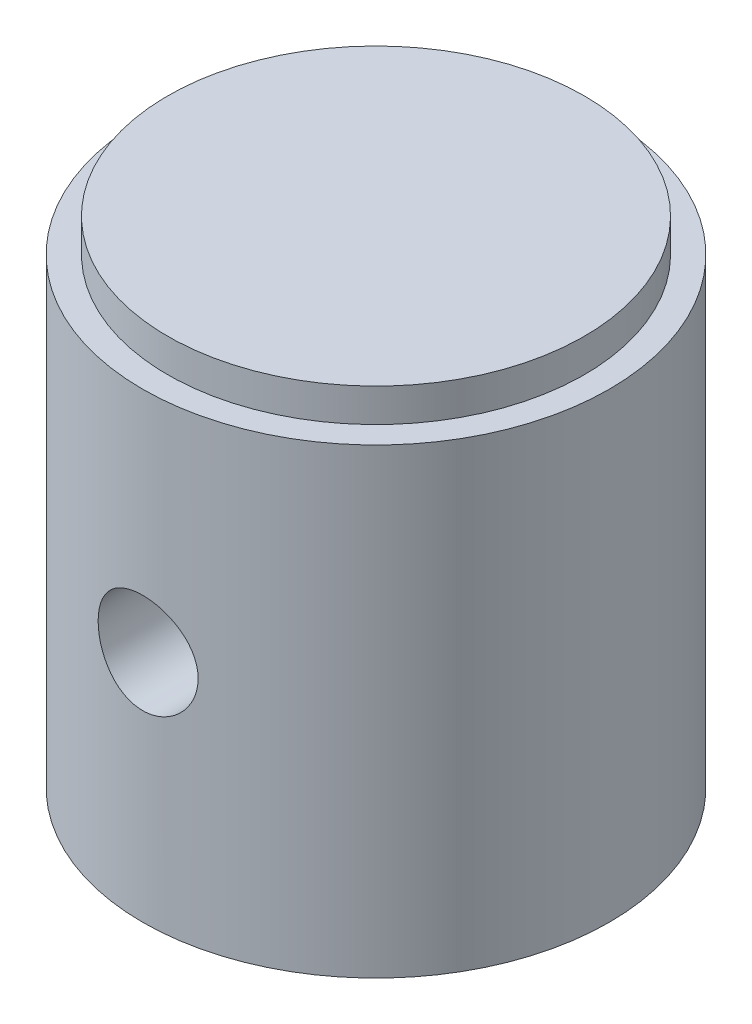
ISO-10303-21;
HEADER;
FILE_DESCRIPTION(('STEP AP214'),'2;1');
FILE_NAME('part.step','',(''),(''),'','','');
FILE_SCHEMA(('AUTOMOTIVE_DESIGN { 1 0 10303 214 1 1 1 1 }'));
ENDSEC;
DATA;
#1=APPLICATION_CONTEXT('core data for automotive mechanical design processes');
#2=APPLICATION_PROTOCOL_DEFINITION('international standard','automotive_design',2000,#1);
#3=PRODUCT_CONTEXT('',#1,'mechanical');
#4=PRODUCT('Part','Part','',(#3));
#5=PRODUCT_RELATED_PRODUCT_CATEGORY('part','',(#4));
#6=PRODUCT_DEFINITION_FORMATION('','',#4);
#7=PRODUCT_DEFINITION_CONTEXT('part definition',#1,'design');
#8=PRODUCT_DEFINITION('design','',#6,#7);
#9=PRODUCT_DEFINITION_SHAPE('','',#8);
#10=(LENGTH_UNIT() NAMED_UNIT(*) SI_UNIT(.MILLI.,.METRE.));
#11=(NAMED_UNIT(*) PLANE_ANGLE_UNIT() SI_UNIT($,.RADIAN.));
#12=(NAMED_UNIT(*) SI_UNIT($,.STERADIAN.) SOLID_ANGLE_UNIT());
#13=UNCERTAINTY_MEASURE_WITH_UNIT(LENGTH_MEASURE(1.E-05),#10,'distance_accuracy_value','');
#14=(GEOMETRIC_REPRESENTATION_CONTEXT(3) GLOBAL_UNCERTAINTY_ASSIGNED_CONTEXT((#13)) GLOBAL_UNIT_ASSIGNED_CONTEXT((#10,
#11,#12)) REPRESENTATION_CONTEXT('',''));
#15=CARTESIAN_POINT('',(0.,0.,0.));
#16=DIRECTION('',(0.,0.,1.));
#17=DIRECTION('',(1.,0.,0.));
#18=AXIS2_PLACEMENT_3D('',#15,#16,#17);
#19=CARTESIAN_POINT('',(0.,14.8540879403809,0.));
#20=DIRECTION('',(0.,-1.,0.));
#21=DIRECTION('',(0.,0.,-1.));
#22=AXIS2_PLACEMENT_3D('',#19,#20,#21);
#23=PLANE('',#22);
#24=CARTESIAN_POINT('',(0.,14.8540879403809,0.));
#25=DIRECTION('',(0.,-1.,0.));
#26=DIRECTION('',(0.,0.,-1.));
#27=AXIS2_PLACEMENT_3D('',#24,#25,#26);
#28=CIRCLE('',#27,6.25);
#29=CARTESIAN_POINT('',(0.,14.8540879403809,-6.25));
#30=VERTEX_POINT('',#29);
#31=EDGE_CURVE('E11',#30,#30,#28,.T.);
#32=ORIENTED_EDGE('',*,*,#31,.F.);
#33=EDGE_LOOP('',(#32));
#34=FACE_BOUND('',#33,.T.);
#35=ADVANCED_FACE('F39',(#34),#23,.F.);
#36=CARTESIAN_POINT('',(0.,0.,0.));
#37=DIRECTION('',(0.,-1.,0.));
#38=DIRECTION('',(0.,0.,-1.));
#39=AXIS2_PLACEMENT_3D('',#36,#37,#38);
#40=CYLINDRICAL_SURFACE('',#39,6.25);
#41=CARTESIAN_POINT('',(0.,13.8540879403809,0.));
#42=DIRECTION('',(0.,-1.,0.));
#43=DIRECTION('',(0.,0.,-1.));
#44=AXIS2_PLACEMENT_3D('',#41,#42,#43);
#45=CIRCLE('',#44,6.25);
#46=CARTESIAN_POINT('',(0.,13.8540879403809,-6.25));
#47=VERTEX_POINT('',#46);
#48=EDGE_CURVE('E51',#47,#47,#45,.T.);
#49=ORIENTED_EDGE('',*,*,#48,.F.);
#50=EDGE_LOOP('',(#49));
#51=FACE_BOUND('',#50,.T.);
#52=ORIENTED_EDGE('',*,*,#31,.T.);
#53=EDGE_LOOP('',(#52));
#54=FACE_BOUND('',#53,.T.);
#55=ADVANCED_FACE('F117',(#51,#54),#40,.T.);
#56=CARTESIAN_POINT('',(0.,13.8540879403809,6.25));
#57=DIRECTION('',(0.,-1.,0.));
#58=DIRECTION('',(0.,0.,-1.));
#59=AXIS2_PLACEMENT_3D('',#56,#57,#58);
#60=PLANE('',#59);
#61=CARTESIAN_POINT('',(0.,13.8540879403809,0.));
#62=DIRECTION('',(0.,-1.,0.));
#63=DIRECTION('',(0.,0.,-1.));
#64=AXIS2_PLACEMENT_3D('',#61,#62,#63);
#65=CIRCLE('',#64,7.);
#66=CARTESIAN_POINT('',(0.,13.8540879403809,-7.));
#67=VERTEX_POINT('',#66);
#68=EDGE_CURVE('E85',#67,#67,#65,.T.);
#69=ORIENTED_EDGE('',*,*,#68,.F.);
#70=EDGE_LOOP('',(#69));
#71=FACE_BOUND('',#70,.T.);
#72=ORIENTED_EDGE('',*,*,#48,.T.);
#73=EDGE_LOOP('',(#72));
#74=FACE_BOUND('',#73,.T.);
#75=ADVANCED_FACE('F113',(#71,#74),#60,.F.);
#76=CARTESIAN_POINT('',(0.,0.,0.));
#77=DIRECTION('',(0.,-1.,0.));
#78=DIRECTION('',(0.,0.,-1.));
#79=AXIS2_PLACEMENT_3D('',#76,#77,#78);
#80=CYLINDRICAL_SURFACE('',#79,7.);
#81=CARTESIAN_POINT('',(0.,8.5,-7.));
#82=CARTESIAN_POINT('',(-0.0832358860906166,8.4999971004257,-6.99999846043226));
#83=CARTESIAN_POINT('',(-0.166507195600275,8.49304839161215,-6.9985002594971));
#84=CARTESIAN_POINT('',(-0.330687344293327,8.46546434314641,-6.99266829827728));
#85=CARTESIAN_POINT('',(-0.41159440357119,8.44481895580507,-6.98833245637099));
#86=CARTESIAN_POINT('',(-0.568649323817737,8.39051563539196,-6.97730831788826));
#87=CARTESIAN_POINT('',(-0.644801963446556,8.35687102061868,-6.97062242967171));
#88=CARTESIAN_POINT('',(-0.790378177960788,8.27756591382874,-6.9556210681797));
#89=CARTESIAN_POINT('',(-0.85980198174737,8.23190583075006,-6.94730565036661));
#90=CARTESIAN_POINT('',(-0.99102479053523,8.12911970032649,-6.92981369246311));
#91=CARTESIAN_POINT('',(-1.05270503419445,8.07184377810147,-6.92062683143259));
#92=CARTESIAN_POINT('',(-1.16566042389435,7.9477736843148,-6.90250069814144));
#93=CARTESIAN_POINT('',(-1.21693467150908,7.88097869174874,-6.8935614473163));
#94=CARTESIAN_POINT('',(-1.30814204379809,7.73889424713956,-6.87684116047225));
#95=CARTESIAN_POINT('',(-1.34794958335009,7.66352248224379,-6.8690733634436));
#96=CARTESIAN_POINT('',(-1.41428823691148,7.50696554623316,-6.85572325558537));
#97=CARTESIAN_POINT('',(-1.44082087001716,7.42578104150743,-6.85014069470711));
#98=CARTESIAN_POINT('',(-1.47946574422454,7.26118891341193,-6.84189808926311));
#99=CARTESIAN_POINT('',(-1.49178779748342,7.17783272433613,-6.83919556896486));
#100=CARTESIAN_POINT('',(-1.50231395206577,7.010195767493,-6.83689139845106));
#101=CARTESIAN_POINT('',(-1.50051971664629,6.92591510982005,-6.83728938291729));
#102=CARTESIAN_POINT('',(-1.48303326340861,6.76037531206621,-6.84110276603832));
#103=CARTESIAN_POINT('',(-1.46758398649408,6.67908911089985,-6.84446541682162));
#104=CARTESIAN_POINT('',(-1.42361054298677,6.52028975971066,-6.85374593375788));
#105=CARTESIAN_POINT('',(-1.39508566936466,6.44277681396768,-6.85966393808402));
#106=CARTESIAN_POINT('',(-1.32554551075991,6.29303712712666,-6.87344080755724));
#107=CARTESIAN_POINT('',(-1.2844361097283,6.22085548728745,-6.88131420983365));
#108=CARTESIAN_POINT('',(-1.19096007283993,6.08432483504204,-6.89810572501288));
#109=CARTESIAN_POINT('',(-1.13859196103562,6.0199768513138,-6.90702397481896));
#110=CARTESIAN_POINT('',(-1.0227954275532,5.8995406443266,-6.92512718393878));
#111=CARTESIAN_POINT('',(-0.959160233964409,5.84365129341526,-6.93431383972178));
#112=CARTESIAN_POINT('',(-0.823317306269096,5.74330626631034,-6.95175017497059));
#113=CARTESIAN_POINT('',(-0.751109428775399,5.69885078139961,-6.95999983875972));
#114=CARTESIAN_POINT('',(-0.599933462049959,5.62258932009307,-6.97465778534003));
#115=CARTESIAN_POINT('',(-0.520952258863482,5.59080858742202,-6.98106238643354));
#116=CARTESIAN_POINT('',(-0.358603146685706,5.54102435167891,-6.99128109245334));
#117=CARTESIAN_POINT('',(-0.275235851133668,5.52301892743668,-6.99509555860384));
#118=CARTESIAN_POINT('',(-0.108187670836629,5.50158378585658,-6.99965306347808));
#119=CARTESIAN_POINT('',(-0.0245431772716145,5.49788228711822,-7.00045336521066));
#120=CARTESIAN_POINT('',(0.142168973650405,5.50442457112516,-6.99905248935969));
#121=CARTESIAN_POINT('',(0.225236668127256,5.51466744796294,-6.99685150675698));
#122=CARTESIAN_POINT('',(0.387542537982806,5.5485822436617,-6.98973143045266));
#123=CARTESIAN_POINT('',(0.466811712908478,5.57211236947253,-6.9848410504546));
#124=CARTESIAN_POINT('',(0.620278450473418,5.63177694299482,-6.9728892442151));
#125=CARTESIAN_POINT('',(0.694475592587741,5.66791243431166,-6.96582763822237));
#126=CARTESIAN_POINT('',(0.836821397964754,5.75233354306033,-6.950175043904));
#127=CARTESIAN_POINT('',(0.904872575111141,5.80077979490973,-6.94156431354275));
#128=CARTESIAN_POINT('',(1.0319769255236,5.90823482488874,-6.92381033034847));
#129=CARTESIAN_POINT('',(1.091028978692,5.96724491588744,-6.91466701142097));
#130=CARTESIAN_POINT('',(1.19952711057989,6.09539737018714,-6.89668172706324));
#131=CARTESIAN_POINT('',(1.24878537255157,6.1647000992221,-6.88784792221285));
#132=CARTESIAN_POINT('',(1.3349641538604,6.31075459647799,-6.87166654559681));
#133=CARTESIAN_POINT('',(1.37188519913706,6.38750604697749,-6.86431891048055));
#134=CARTESIAN_POINT('',(1.43209741248548,6.5458722989946,-6.8520100980739));
#135=CARTESIAN_POINT('',(1.45546398641275,6.62745735643067,-6.84703574582967));
#136=CARTESIAN_POINT('',(1.48812696085335,6.79351558383364,-6.84001186708418));
#137=CARTESIAN_POINT('',(1.49742550780258,6.87798831120132,-6.83796189439706));
#138=CARTESIAN_POINT('',(1.5015999992604,7.04553234317524,-6.83704618848155));
#139=CARTESIAN_POINT('',(1.49677347258311,7.12859601498058,-6.83811476518543));
#140=CARTESIAN_POINT('',(1.47349789406331,7.29269724213259,-6.8431676318483));
#141=CARTESIAN_POINT('',(1.45504898957979,7.37373481938658,-6.84715189026714));
#142=CARTESIAN_POINT('',(1.40519345940434,7.53125865786917,-6.85755581104157));
#143=CARTESIAN_POINT('',(1.37382847170887,7.60775864866429,-6.86396764224703));
#144=CARTESIAN_POINT('',(1.29906751595601,7.75445537250685,-6.87850764590649));
#145=CARTESIAN_POINT('',(1.255670353015,7.82465147861504,-6.88663598880363));
#146=CARTESIAN_POINT('',(1.15708290349304,7.95821819372537,-6.90389055593232));
#147=CARTESIAN_POINT('',(1.10167987421237,8.02142969594698,-6.91303309938926));
#148=CARTESIAN_POINT('',(0.981086554619621,8.13775626252046,-6.93117449799694));
#149=CARTESIAN_POINT('',(0.915894009385597,8.1908689943122,-6.94017331951296));
#150=CARTESIAN_POINT('',(0.776603147268716,8.28611595950556,-6.95714491048987));
#151=CARTESIAN_POINT('',(0.70240484600964,8.32810660623098,-6.96510364570626));
#152=CARTESIAN_POINT('',(0.547850160940597,8.39895452890618,-6.97895826104019));
#153=CARTESIAN_POINT('',(0.467499105863879,8.42782302258504,-6.98485590212343));
#154=CARTESIAN_POINT('',(0.322535217553204,8.46635218513115,-6.99284848461772));
#155=CARTESIAN_POINT('',(0.258717205545979,8.47894643398003,-6.99551391888263));
#156=CARTESIAN_POINT('',(0.129939960853847,8.49577130171167,-6.99909024154719));
#157=CARTESIAN_POINT('',(0.0649807750887453,8.50000226364606,-7.00000120191314));
#158=CARTESIAN_POINT('',(0.,8.5,-7.));
#159=B_SPLINE_CURVE_WITH_KNOTS('',3,(#81,#82,#83,#84,#85,#86,#87,#88,#89,#90,#91,#92,#93,#94,
#95,#96,#97,#98,#99,#100,#101,#102,#103,#104,#105,#106,#107,#108,#109,#110,#111,#112,#113,#114,
#115,#116,#117,#118,#119,#120,#121,#122,#123,#124,#125,#126,#127,#128,#129,#130,#131,#132,#133,
#134,#135,#136,#137,#138,#139,#140,#141,#142,#143,#144,#145,#146,#147,#148,#149,#150,#151,#152,
#153,#154,#155,#156,#157,#158),.UNSPECIFIED.,.T.,.F.,(4,2,2,2,2,2,2,2,2,2,2,2,2,2,2,2,2,2,2,2,2,
2,2,2,2,2,2,2,2,2,2,2,2,2,2,2,2,2,4),(0.,0.249469836512082,0.499122883219936,0.748520824425603,
0.997910278645887,1.25074961881732,1.50361077918507,1.7591442921451,2.0146485567749,
2.26633008124666,2.51798195169165,2.76524475452928,3.01252092904568,3.26169356165968,
3.51089887920889,3.76527011050291,4.0196455970235,4.27452521139806,4.52936927256343,
4.77934665704185,5.02930780231429,5.27665060589267,5.52401389198434,5.77478733867803,
6.02559197304485,6.28082063283534,6.53603841075806,6.78982240408475,7.04356767229185,
7.29200680540294,7.5404432510827,7.78808499706785,8.03575134451623,8.28822950154114,
8.54076590397115,8.79641910357222,9.05185334010271,9.24661799132294,9.44137465337336),.UNSPECIFIED.);
#160=CARTESIAN_POINT('',(0.,8.5,-7.));
#161=VERTEX_POINT('',#160);
#162=EDGE_CURVE('E66',#161,#161,#159,.T.);
#163=ORIENTED_EDGE('',*,*,#162,.T.);
#164=EDGE_LOOP('',(#163));
#165=FACE_BOUND('',#164,.T.);
#166=CARTESIAN_POINT('',(1.5,7.,6.83739716558867));
#167=CARTESIAN_POINT('',(1.49999708238613,6.91678884751805,6.83739884558951));
#168=CARTESIAN_POINT('',(1.49305236244768,6.83354222605788,6.83893272341929));
#169=CARTESIAN_POINT('',(1.46548559252999,6.66941332775799,6.84489178429867));
#170=CARTESIAN_POINT('',(1.44485339653622,6.58853285132379,6.84931911211841));
#171=CARTESIAN_POINT('',(1.39058863684599,6.4315342504258,6.86054115293409));
#172=CARTESIAN_POINT('',(1.35697000991314,6.35541112187853,6.86733332725825));
#173=CARTESIAN_POINT('',(1.27772617673341,6.20988472605539,6.88251670848644));
#174=CARTESIAN_POINT('',(1.23210132048776,6.14048126297092,6.89090786877545));
#175=CARTESIAN_POINT('',(1.12935142570221,6.00923703851788,6.90849578796654));
#176=CARTESIAN_POINT('',(1.07206859483983,5.94752112376004,6.91770249871754));
#177=CARTESIAN_POINT('',(0.947969508129577,5.83449644559421,6.93579691710397));
#178=CARTESIAN_POINT('',(0.881152530217676,5.78318847113993,6.94468460051417));
#179=CARTESIAN_POINT('',(0.739047288464582,5.69194455550857,6.96124769109432));
#180=CARTESIAN_POINT('',(0.663680488229953,5.65212834422938,6.96890998819429));
#181=CARTESIAN_POINT('',(0.507134269342595,5.58577230855371,6.98204671042934));
#182=CARTESIAN_POINT('',(0.425955477380312,5.55923105521372,6.98752137103329));
#183=CARTESIAN_POINT('',(0.261387187671511,5.52057002906866,6.9955956528118));
#184=CARTESIAN_POINT('',(0.178049400596923,5.50823907144757,6.99823733378385));
#185=CARTESIAN_POINT('',(0.0104489453066445,5.49768872268674,7.00049362207002));
#186=CARTESIAN_POINT('',(-0.0738136201647594,5.49946777943924,7.00010856232698));
#187=CARTESIAN_POINT('',(-0.239417029250512,5.51692896466358,6.99638700862558));
#188=CARTESIAN_POINT('',(-0.320783115362113,5.53238350028992,6.99309883152432));
#189=CARTESIAN_POINT('',(-0.479739463978389,5.57639468185186,6.98399541589104));
#190=CARTESIAN_POINT('',(-0.557329560175054,5.60495190429974,6.97818006616518));
#191=CARTESIAN_POINT('',(-0.707167497556553,5.67456145888852,6.96459754646858));
#192=CARTESIAN_POINT('',(-0.779373657015789,5.71570076720435,6.95681685803946));
#193=CARTESIAN_POINT('',(-0.915940926562847,5.8092419681636,6.94015793743865));
#194=CARTESIAN_POINT('',(-0.980301006451529,5.8616453373003,6.93127956144693));
#195=CARTESIAN_POINT('',(-1.10070208800198,5.97746854452786,6.91319326460925));
#196=CARTESIAN_POINT('',(-1.15655117320251,6.04108757935704,6.90398230372853));
#197=CARTESIAN_POINT('',(-1.25682243234728,6.17688328506851,6.88643566831974));
#198=CARTESIAN_POINT('',(-1.30124432118068,6.24906016940525,6.87810001563386));
#199=CARTESIAN_POINT('',(-1.37748077573297,6.40022450106376,6.86324023586723));
#200=CARTESIAN_POINT('',(-1.40926035088923,6.47923012385244,6.85672115127775));
#201=CARTESIAN_POINT('',(-1.45903495159116,6.64163276594644,6.84630340806617));
#202=CARTESIAN_POINT('',(-1.47703206694628,6.72502911744319,6.84240435218483));
#203=CARTESIAN_POINT('',(-1.49843586024652,6.89209575264972,6.83774881255446));
#204=CARTESIAN_POINT('',(-1.5021214192864,6.97572867507731,6.83693227051701));
#205=CARTESIAN_POINT('',(-1.49555139642373,7.1424139931817,6.83837239573994));
#206=CARTESIAN_POINT('',(-1.48529673081635,7.22546642665355,6.84062886101063));
#207=CARTESIAN_POINT('',(-1.45137894635584,7.38767043498076,6.84790415484206));
#208=CARTESIAN_POINT('',(-1.42786830251553,7.46685543259696,6.85289155274364));
#209=CARTESIAN_POINT('',(-1.36827052946749,7.62016233753292,6.86503859869777));
#210=CARTESIAN_POINT('',(-1.33218223662818,7.69428377563419,6.87219844772849));
#211=CARTESIAN_POINT('',(-1.24783504416705,7.83656968475892,6.88801634080345));
#212=CARTESIAN_POINT('',(-1.19940368590792,7.90462958201219,6.89669501746317));
#213=CARTESIAN_POINT('',(-1.09197183833601,8.0317583458738,6.91451775360139));
#214=CARTESIAN_POINT('',(-1.03297009182161,8.09082614144847,6.92366186834461));
#215=CARTESIAN_POINT('',(-0.904812764420815,8.19937030294476,6.94158239990173));
#216=CARTESIAN_POINT('',(-0.835494925828771,8.24865691615701,6.95034935607746));
#217=CARTESIAN_POINT('',(-0.689401481282277,8.33488540935105,6.96635610714901));
#218=CARTESIAN_POINT('',(-0.61262621604374,8.37182785297283,6.97359597176692));
#219=CARTESIAN_POINT('',(-0.45426541898204,8.43205205463848,6.98569278381574));
#220=CARTESIAN_POINT('',(-0.372713193075172,8.45541830374628,6.99056443803698));
#221=CARTESIAN_POINT('',(-0.206725177003289,8.48809170573232,6.9974393930198));
#222=CARTESIAN_POINT('',(-0.122289789973993,8.49740081597391,6.99944309312296));
#223=CARTESIAN_POINT('',(0.0452637170528294,8.50161065241186,7.00034511009057));
#224=CARTESIAN_POINT('',(0.12837450550923,8.49679515860463,6.99930459001667));
#225=CARTESIAN_POINT('',(0.292572938415961,8.47352523648097,6.99436552363383));
#226=CARTESIAN_POINT('',(0.373660616405286,8.45507103442168,6.99046702473686));
#227=CARTESIAN_POINT('',(0.53130194848727,8.40518119375051,6.98025388638537));
#228=CARTESIAN_POINT('',(0.607868365073178,8.37378431061444,6.97394646430493));
#229=CARTESIAN_POINT('',(0.754684956723221,8.29893872883088,6.95959036050661));
#230=CARTESIAN_POINT('',(0.824934544796142,8.25548891169397,6.9515415172034));
#231=CARTESIAN_POINT('',(0.958512306895243,8.15683768125733,6.93439809934493));
#232=CARTESIAN_POINT('',(1.02169036510577,8.10143584167869,6.92528708907874));
#233=CARTESIAN_POINT('',(1.13795001457643,7.98085938974965,6.90713690075836));
#234=CARTESIAN_POINT('',(1.19102918062422,7.9156824366444,6.89809774045682));
#235=CARTESIAN_POINT('',(1.28623261596675,7.77640950681433,6.88098693651916));
#236=CARTESIAN_POINT('',(1.32820897809616,7.70221064171298,6.87292905956533));
#237=CARTESIAN_POINT('',(1.39903004659825,7.54765627907675,6.85886497228049));
#238=CARTESIAN_POINT('',(1.42788606423931,7.46730615474693,6.85285699581573));
#239=CARTESIAN_POINT('',(1.46638607121557,7.32237386881414,6.84470560641996));
#240=CARTESIAN_POINT('',(1.47896752507743,7.25858832429217,6.84198283087953));
#241=CARTESIAN_POINT('',(1.49577544043437,7.12987568842268,6.83832799504406));
#242=CARTESIAN_POINT('',(1.50000227727981,7.06494864849168,6.83739585430069));
#243=CARTESIAN_POINT('',(1.5,7.,6.83739716558867));
#244=B_SPLINE_CURVE_WITH_KNOTS('',3,(#166,#167,#168,#169,#170,#171,#172,#173,#174,#175,#176,
#177,#178,#179,#180,#181,#182,#183,#184,#185,#186,#187,#188,#189,#190,#191,#192,#193,#194,#195,
#196,#197,#198,#199,#200,#201,#202,#203,#204,#205,#206,#207,#208,#209,#210,#211,#212,#213,#214,
#215,#216,#217,#218,#219,#220,#221,#222,#223,#224,#225,#226,#227,#228,#229,#230,#231,#232,#233,
#234,#235,#236,#237,#238,#239,#240,#241,#242,#243),.UNSPECIFIED.,.T.,.F.,(4,2,2,2,2,2,2,2,2,2,2,
2,2,2,2,2,2,2,2,2,2,2,2,2,2,2,2,2,2,2,2,2,2,2,2,2,2,2,4),(0.,0.249395482027528,
0.498976038479964,0.74828949115276,0.997595676735284,1.25053229582692,1.50348808112879,
1.75899134820278,2.01446710646268,2.26609508151929,2.51769537777241,2.76518557667372,
3.01268666607584,3.26193888143437,3.51122378872315,3.76548960779295,4.01976177023092,
4.27473287411781,4.52966530953839,4.77960433192523,5.02952692653917,5.27663180749375,
5.5237595556315,5.77455010216318,6.02537049659078,6.2806621468321,6.53594213875541,
6.78961589824375,7.04325433208539,7.29183199644127,7.540405537151,7.78824009619483,
8.03609766151365,8.28848914160965,8.54094115631232,8.79660380167249,9.05204561611687,
9.24671456122272,9.44137476018022),.UNSPECIFIED.);
#245=CARTESIAN_POINT('',(1.5,7.,6.83739716558867));
#246=VERTEX_POINT('',#245);
#247=EDGE_CURVE('E72',#246,#246,#244,.T.);
#248=ORIENTED_EDGE('',*,*,#247,.T.);
#249=EDGE_LOOP('',(#248));
#250=FACE_BOUND('',#249,.T.);
#251=CARTESIAN_POINT('',(0.,0.,0.));
#252=DIRECTION('',(0.,-1.,0.));
#253=DIRECTION('',(0.,0.,-1.));
#254=AXIS2_PLACEMENT_3D('',#251,#252,#253);
#255=CIRCLE('',#254,7.);
#256=CARTESIAN_POINT('',(0.,0.,-7.));
#257=VERTEX_POINT('',#256);
#258=EDGE_CURVE('E82',#257,#257,#255,.T.);
#259=ORIENTED_EDGE('',*,*,#258,.F.);
#260=EDGE_LOOP('',(#259));
#261=FACE_BOUND('',#260,.T.);
#262=ORIENTED_EDGE('',*,*,#68,.T.);
#263=EDGE_LOOP('',(#262));
#264=FACE_BOUND('',#263,.T.);
#265=ADVANCED_FACE('F107',(#165,#250,#261,#264),#80,.T.);
#266=CARTESIAN_POINT('',(0.,0.,7.));
#267=DIRECTION('',(0.,1.,0.));
#268=DIRECTION('',(0.,0.,1.));
#269=AXIS2_PLACEMENT_3D('',#266,#267,#268);
#270=PLANE('',#269);
#271=CARTESIAN_POINT('',(0.,0.,0.));
#272=DIRECTION('',(0.,-1.,0.));
#273=DIRECTION('',(0.,0.,-1.));
#274=AXIS2_PLACEMENT_3D('',#271,#272,#273);
#275=CIRCLE('',#274,6.2);
#276=CARTESIAN_POINT('',(0.,0.,-6.2));
#277=VERTEX_POINT('',#276);
#278=EDGE_CURVE('E69',#277,#277,#275,.T.);
#279=ORIENTED_EDGE('',*,*,#278,.F.);
#280=EDGE_LOOP('',(#279));
#281=FACE_BOUND('',#280,.T.);
#282=ORIENTED_EDGE('',*,*,#258,.T.);
#283=EDGE_LOOP('',(#282));
#284=FACE_BOUND('',#283,.T.);
#285=ADVANCED_FACE('F112',(#281,#284),#270,.F.);
#286=CARTESIAN_POINT('',(0.,0.,0.));
#287=DIRECTION('',(0.,-1.,0.));
#288=DIRECTION('',(0.,0.,-1.));
#289=AXIS2_PLACEMENT_3D('',#286,#287,#288);
#290=CONICAL_SURFACE('',#289,6.2,0.349065850398863);
#291=CARTESIAN_POINT('',(0.,3.98384225820924,0.));
#292=DIRECTION('',(0.,-1.,0.));
#293=DIRECTION('',(0.,0.,-1.));
#294=AXIS2_PLACEMENT_3D('',#291,#292,#293);
#295=CIRCLE('',#294,4.75);
#296=CARTESIAN_POINT('',(0.,3.98384225820924,-4.75));
#297=VERTEX_POINT('',#296);
#298=EDGE_CURVE('E65',#297,#297,#295,.T.);
#299=ORIENTED_EDGE('',*,*,#298,.F.);
#300=EDGE_LOOP('',(#299));
#301=FACE_BOUND('',#300,.T.);
#302=ORIENTED_EDGE('',*,*,#278,.T.);
#303=EDGE_LOOP('',(#302));
#304=FACE_BOUND('',#303,.T.);
#305=ADVANCED_FACE('F158',(#301,#304),#290,.F.);
#306=CARTESIAN_POINT('',(0.,0.,0.));
#307=DIRECTION('',(0.,-1.,0.));
#308=DIRECTION('',(0.,0.,-1.));
#309=AXIS2_PLACEMENT_3D('',#306,#307,#308);
#310=CYLINDRICAL_SURFACE('',#309,4.75);
#311=CARTESIAN_POINT('',(0.,8.5,-4.75));
#312=CARTESIAN_POINT('',(0.0820835447314043,8.4999995960029,-4.74999967904615));
#313=CARTESIAN_POINT('',(0.164171496501827,8.49324013050539,-4.74785228936724));
#314=CARTESIAN_POINT('',(0.325944116631497,8.46645355077682,-4.73949648091444));
#315=CARTESIAN_POINT('',(0.405628283459122,8.44642368752273,-4.73328722070904));
#316=CARTESIAN_POINT('',(0.560237269504344,8.39384104381599,-4.71748543187023));
#317=CARTESIAN_POINT('',(0.635169334090949,8.36130788889304,-4.7078982073406));
#318=CARTESIAN_POINT('',(0.778514579207214,8.28472646357131,-4.68632862599565));
#319=CARTESIAN_POINT('',(0.846926688392994,8.24067630516156,-4.67434587655187));
#320=CARTESIAN_POINT('',(0.977443078754499,8.14085266257358,-4.64883376662147));
#321=CARTESIAN_POINT('',(1.03931346588882,8.08478215126322,-4.63527018347255));
#322=CARTESIAN_POINT('',(1.15294742613925,7.96314171987723,-4.60832176901776));
#323=CARTESIAN_POINT('',(1.2047090669501,7.89756998779059,-4.5949369723419));
#324=CARTESIAN_POINT('',(1.29793466853577,7.75675121788412,-4.56949296853185));
#325=CARTESIAN_POINT('',(1.33910462019172,7.68130119655586,-4.55747591989588));
#326=CARTESIAN_POINT('',(1.40807389327236,7.52410753822376,-4.53664362085522));
#327=CARTESIAN_POINT('',(1.4358768216778,7.44236560595466,-4.52782750686213));
#328=CARTESIAN_POINT('',(1.47646364106285,7.27755109763056,-4.51475360613692));
#329=CARTESIAN_POINT('',(1.48968210274354,7.1945962655912,-4.51036428133252));
#330=CARTESIAN_POINT('',(1.50208257395981,7.02753910178015,-4.50625061102435));
#331=CARTESIAN_POINT('',(1.50126840605207,6.94343708874345,-4.50652499510326));
#332=CARTESIAN_POINT('',(1.48596623804715,6.7800844811611,-4.51159176137022));
#333=CARTESIAN_POINT('',(1.47203288124122,6.70077528375917,-4.51620087396631));
#334=CARTESIAN_POINT('',(1.43178798005592,6.5456834725574,-4.52911970742075));
#335=CARTESIAN_POINT('',(1.40547509472982,6.46990124177497,-4.53742982916608));
#336=CARTESIAN_POINT('',(1.34083084084602,6.32270273212435,-4.55695325959034));
#337=CARTESIAN_POINT('',(1.30232683858134,6.25136797684519,-4.56820783899944));
#338=CARTESIAN_POINT('',(1.21451321691615,6.11599117565043,-4.59233341866295));
#339=CARTESIAN_POINT('',(1.16520074091948,6.05195106446551,-4.60520484585311));
#340=CARTESIAN_POINT('',(1.05445721763047,5.9298486385015,-4.63184688202887));
#341=CARTESIAN_POINT('',(0.992568961591256,5.87220327092588,-4.64563145900086));
#342=CARTESIAN_POINT('',(0.859832533931192,5.7680067597299,-4.67201892608795));
#343=CARTESIAN_POINT('',(0.78898367078958,5.72145647315559,-4.68462172487032));
#344=CARTESIAN_POINT('',(0.639521244304238,5.64048095552522,-4.70736283385871));
#345=CARTESIAN_POINT('',(0.560849403229559,5.6061570539756,-4.71748034190943));
#346=CARTESIAN_POINT('',(0.398454273025005,5.55135522219803,-4.73396063106369));
#347=CARTESIAN_POINT('',(0.314732560358457,5.53087299501026,-4.74032457733139));
#348=CARTESIAN_POINT('',(0.148151942001062,5.50505054086085,-4.74839235389519));
#349=CARTESIAN_POINT('',(0.0653887879529904,5.49914603419765,-4.75026975398177));
#350=CARTESIAN_POINT('',(-0.0999556894804202,5.50105311741636,-4.74966735792893));
#351=CARTESIAN_POINT('',(-0.182537038204382,5.50886265646202,-4.74718821327919));
#352=CARTESIAN_POINT('',(-0.342984606452105,5.53752408988407,-4.73826543461407));
#353=CARTESIAN_POINT('',(-0.420917353280695,5.55803859127942,-4.73192442641255));
#354=CARTESIAN_POINT('',(-0.572211571751272,5.61111437313638,-4.71602217273613));
#355=CARTESIAN_POINT('',(-0.645572474036247,5.64367715054722,-4.70646052712339));
#356=CARTESIAN_POINT('',(-0.787656381223484,5.7208230900637,-4.68480447515659));
#357=CARTESIAN_POINT('',(-0.85622009899537,5.76568325707307,-4.67265334948307));
#358=CARTESIAN_POINT('',(-0.98503489825459,5.86581932112607,-4.64720609363859));
#359=CARTESIAN_POINT('',(-1.04528367215737,5.92109809954076,-4.63390964727142));
#360=CARTESIAN_POINT('',(-1.15829337789972,6.04315659674265,-4.60699149316922));
#361=CARTESIAN_POINT('',(-1.21065200367447,6.11031156057145,-4.593378435549));
#362=CARTESIAN_POINT('',(-1.30339506663711,6.25275003854341,-4.5679297313532));
#363=CARTESIAN_POINT('',(-1.34377965554056,6.32803344967959,-4.55609406225838));
#364=CARTESIAN_POINT('',(-1.41118548758715,6.48446194888063,-4.53566962908159));
#365=CARTESIAN_POINT('',(-1.43825519702983,6.56558452692426,-4.52706911631109));
#366=CARTESIAN_POINT('',(-1.47824972090378,6.73156480012263,-4.5141696846939));
#367=CARTESIAN_POINT('',(-1.49118006577835,6.81642102138811,-4.50986908404445));
#368=CARTESIAN_POINT('',(-1.50212620605735,6.9832469259302,-4.50623416787646));
#369=CARTESIAN_POINT('',(-1.50080314084641,7.06516895999845,-4.50667969384457));
#370=CARTESIAN_POINT('',(-1.48488083195079,7.22756165788627,-4.51195053556042));
#371=CARTESIAN_POINT('',(-1.47028223238921,7.3080323919291,-4.51677563881295));
#372=CARTESIAN_POINT('',(-1.42866989928935,7.46402847078252,-4.53010652438159));
#373=CARTESIAN_POINT('',(-1.40184917312304,7.53961057278835,-4.53855497041869));
#374=CARTESIAN_POINT('',(-1.33670650315647,7.6852619957888,-4.55816492249634));
#375=CARTESIAN_POINT('',(-1.29838218467217,7.75533017477247,-4.56932698861838));
#376=CARTESIAN_POINT('',(-1.2095354013046,7.89098674529753,-4.5936611779216));
#377=CARTESIAN_POINT('',(-1.15858784628932,7.9562855082684,-4.60689565835744));
#378=CARTESIAN_POINT('',(-1.0466842406539,8.07762083763069,-4.63360081206469));
#379=CARTESIAN_POINT('',(-0.985725490335814,8.13365489742713,-4.64707154816902));
#380=CARTESIAN_POINT('',(-0.85306632642395,8.23675692430509,-4.67327443028954));
#381=CARTESIAN_POINT('',(-0.781073823515225,8.28346039072967,-4.68596655437371));
#382=CARTESIAN_POINT('',(-0.629859472842859,8.36404168437099,-4.70867379243005));
#383=CARTESIAN_POINT('',(-0.550640331972043,8.39792428963458,-4.71868990328235));
#384=CARTESIAN_POINT('',(-0.393635914977816,8.44959876910323,-4.7342664308075));
#385=CARTESIAN_POINT('',(-0.316225133186438,8.46844387958559,-4.74011460510933));
#386=CARTESIAN_POINT('',(-0.159210635950566,8.49364336266444,-4.7479811380776));
#387=CARTESIAN_POINT('',(-0.0796073905560847,8.50000039181002,-4.75000031127187));
#388=CARTESIAN_POINT('',(0.,8.5,-4.75));
#389=B_SPLINE_CURVE_WITH_KNOTS('',3,(#311,#312,#313,#314,#315,#316,#317,#318,#319,#320,#321,
#322,#323,#324,#325,#326,#327,#328,#329,#330,#331,#332,#333,#334,#335,#336,#337,#338,#339,#340,
#341,#342,#343,#344,#345,#346,#347,#348,#349,#350,#351,#352,#353,#354,#355,#356,#357,#358,#359,
#360,#361,#362,#363,#364,#365,#366,#367,#368,#369,#370,#371,#372,#373,#374,#375,#376,#377,#378,
#379,#380,#381,#382,#383,#384,#385,#386,#387,#388),.UNSPECIFIED.,.T.,.F.,(4,2,2,2,2,2,2,2,2,2,2,
2,2,2,2,2,2,2,2,2,2,2,2,2,2,2,2,2,2,2,2,2,2,2,2,2,2,2,4),(0.,0.24595797085269,0.49196690895122,
0.737591271008995,0.983255924152798,1.23588716608584,1.4885666517754,1.74764569043262,
2.00665477945945,2.25771831624514,2.50871346318116,2.74955211816805,2.99041686673246,
3.23485763830864,3.47936309176113,3.73524847406481,3.99115361598384,4.24913282924923,
4.50703191953742,4.75477968540459,5.00249040554177,5.24388939060298,5.48531837858215,
5.73270991189647,5.98016996447342,6.23765665880274,6.49514009053908,6.75167921313646,
7.00811795759371,7.25271509638718,7.49730036806766,7.73815036093372,7.97905010664366,
8.22954585775128,8.48010927077556,8.73909121554316,8.99797654827696,9.23656564494835,
9.47510398183575),.UNSPECIFIED.);
#390=CARTESIAN_POINT('',(0.,8.5,-4.75));
#391=VERTEX_POINT('',#390);
#392=EDGE_CURVE('E42',#391,#391,#389,.T.);
#393=ORIENTED_EDGE('',*,*,#392,.T.);
#394=EDGE_LOOP('',(#393));
#395=FACE_BOUND('',#394,.T.);
#396=CARTESIAN_POINT('',(1.5,7.,4.50693909432999));
#397=CARTESIAN_POINT('',(1.49999958004515,7.08196828267614,4.50693949515469));
#398=CARTESIAN_POINT('',(1.49325840231682,7.16394098372474,4.50919970874085));
#399=CARTESIAN_POINT('',(1.46655104887094,7.32547500949945,4.5179553253781));
#400=CARTESIAN_POINT('',(1.44658152131253,7.40503571772268,4.52445180182028));
#401=CARTESIAN_POINT('',(1.39417508352591,7.55938220284953,4.54087234787262));
#402=CARTESIAN_POINT('',(1.36176059537411,7.63417628681151,4.55079024986066));
#403=CARTESIAN_POINT('',(1.28545946652237,7.77728605600465,4.57292751994247));
#404=CARTESIAN_POINT('',(1.24157071835092,7.84560054798797,4.58514731070763));
#405=CARTESIAN_POINT('',(1.14191784971278,7.97620867145206,4.6109923380212));
#406=CARTESIAN_POINT('',(1.08582030493755,8.03824156373591,4.62464992232587));
#407=CARTESIAN_POINT('',(0.964055421977067,8.15219435282351,4.65155671093151));
#408=CARTESIAN_POINT('',(0.898386720233771,8.20411280620364,4.66480585671778));
#409=CARTESIAN_POINT('',(0.757464836701735,8.29751850612538,4.68977365915903));
#410=CARTESIAN_POINT('',(0.682025001056138,8.33873651170335,4.70144979545653));
#411=CARTESIAN_POINT('',(0.524852067423557,8.40779725722458,4.72157773016225));
#412=CARTESIAN_POINT('',(0.443120487221092,8.43564321130615,4.73003030329318));
#413=CARTESIAN_POINT('',(0.278414775826808,8.47629673110112,4.74252974850081));
#414=CARTESIAN_POINT('',(0.195560751143444,8.48955010145606,4.74670693307633));
#415=CARTESIAN_POINT('',(0.0287067286102965,8.50205550409757,4.75064554540298));
#416=CARTESIAN_POINT('',(-0.0552929988694207,8.50131078451008,4.75040799755164));
#417=CARTESIAN_POINT('',(-0.218913619351864,8.48613280044412,4.74563427350171));
#418=CARTESIAN_POINT('',(-0.298584494979865,8.47218295028315,4.74124990899214));
#419=CARTESIAN_POINT('',(-0.454390311754809,8.43178484234958,4.72886249486103));
#420=CARTESIAN_POINT('',(-0.530525020335841,8.40533576380501,4.72085920760149));
#421=CARTESIAN_POINT('',(-0.678203652675078,8.34038381811517,4.7019310355991));
#422=CARTESIAN_POINT('',(-0.749679013295809,8.30173567232402,4.69097118266663));
#423=CARTESIAN_POINT('',(-0.885279102378908,8.21359968541286,4.66728249867119));
#424=CARTESIAN_POINT('',(-0.949401935733848,8.16410905917775,4.65455321340063));
#425=CARTESIAN_POINT('',(-1.07135837440922,8.05321803376508,4.62803989727125));
#426=CARTESIAN_POINT('',(-1.12880871974839,7.99140076594742,4.61423403233704));
#427=CARTESIAN_POINT('',(-1.23264301054731,7.85888184102085,4.58758892442481));
#428=CARTESIAN_POINT('',(-1.2790255944206,7.7881790924274,4.57474980051078));
#429=CARTESIAN_POINT('',(-1.35986638692084,7.63879322816875,4.55138024059369));
#430=CARTESIAN_POINT('',(-1.39417963639867,7.5600268613839,4.54087839223385));
#431=CARTESIAN_POINT('',(-1.44893342452635,7.39742189828439,4.5237069894911));
#432=CARTESIAN_POINT('',(-1.46937907304313,7.31358518268336,4.5170360236621));
#433=CARTESIAN_POINT('',(-1.49507161979024,7.14689763967609,4.5085959379324));
#434=CARTESIAN_POINT('',(-1.50090655288536,7.06414699632123,4.50663729609299));
#435=CARTESIAN_POINT('',(-1.49886513965521,6.89884228403352,4.50731687465408));
#436=CARTESIAN_POINT('',(-1.49099096720734,6.81628818601273,4.50995436623754));
#437=CARTESIAN_POINT('',(-1.46228084598242,6.65627331210253,4.51934163323602));
#438=CARTESIAN_POINT('',(-1.4418371919129,6.57873407933305,4.5259668251803));
#439=CARTESIAN_POINT('',(-1.38903056686353,6.42819606752119,4.54245022183902));
#440=CARTESIAN_POINT('',(-1.35666562487664,6.35519804163378,4.55230896114271));
#441=CARTESIAN_POINT('',(-1.2798587413425,6.21345829627849,4.57450539166734));
#442=CARTESIAN_POINT('',(-1.2350921421442,6.14490277172614,4.58690698850857));
#443=CARTESIAN_POINT('',(-1.13512998682984,6.01606295424143,4.61266077618539));
#444=CARTESIAN_POINT('',(-1.07993166463933,5.9557808624266,4.62601321856053));
#445=CARTESIAN_POINT('',(-0.957886037531119,5.84255822339201,4.65285013455169));
#446=CARTESIAN_POINT('',(-0.890643665109767,5.79003801711159,4.66631614662306));
#447=CARTESIAN_POINT('',(-0.747973360630616,5.69700869180867,4.6912975579683));
#448=CARTESIAN_POINT('',(-0.672545793179843,5.65649903807951,4.70281304406929));
#449=CARTESIAN_POINT('',(-0.516099288450847,5.58902763746837,4.72253168708172));
#450=CARTESIAN_POINT('',(-0.435125281433142,5.56196896821548,4.73075845435933));
#451=CARTESIAN_POINT('',(-0.269469399491868,5.521946955657,4.7430763734001));
#452=CARTESIAN_POINT('',(-0.184788721002361,5.50897909853475,4.74716884950256));
#453=CARTESIAN_POINT('',(-0.0179886485878241,5.49787969673414,4.7506674317259));
#454=CARTESIAN_POINT('',(0.0640868361538648,5.49914159728498,4.75026513795577));
#455=CARTESIAN_POINT('',(0.226803220963033,5.51499454533605,4.74528029002946));
#456=CARTESIAN_POINT('',(0.307444217580877,5.52958469227172,4.74069801830655));
#457=CARTESIAN_POINT('',(0.463969836764499,5.57129105994288,4.72793024704182));
#458=CARTESIAN_POINT('',(0.539902672774311,5.5982419327476,4.71979237633648));
#459=CARTESIAN_POINT('',(0.686204345183072,5.66375485659461,4.70075227796057));
#460=CARTESIAN_POINT('',(0.756572215112847,5.70231891893586,4.68984957149724));
#461=CARTESIAN_POINT('',(0.892382156713932,5.79149731947347,4.66594837362514));
#462=CARTESIAN_POINT('',(0.957571386267191,5.84248067140566,4.65289067194133));
#463=CARTESIAN_POINT('',(1.07867009763973,5.95440321249846,4.62631837968684));
#464=CARTESIAN_POINT('',(1.13457676425287,6.0153454108894,4.61280365200012));
#465=CARTESIAN_POINT('',(1.23744612372159,6.14794144277214,4.58630016066439));
#466=CARTESIAN_POINT('',(1.28403955823579,6.21988929825807,4.5733449634976));
#467=CARTESIAN_POINT('',(1.36442560849337,6.37098605672067,4.55001145096037));
#468=CARTESIAN_POINT('',(1.39822313048984,6.45013218524502,4.53963214845841));
#469=CARTESIAN_POINT('',(1.44974900503547,6.60694645257124,4.52342799882926));
#470=CARTESIAN_POINT('',(1.46853682069789,6.6842364458579,4.51730787458817));
#471=CARTESIAN_POINT('',(1.4936609032698,6.84101662585257,4.50906374742014));
#472=CARTESIAN_POINT('',(1.50000040727695,6.92050623511172,4.50693870560567));
#473=CARTESIAN_POINT('',(1.5,7.,4.50693909432999));
#474=B_SPLINE_CURVE_WITH_KNOTS('',3,(#396,#397,#398,#399,#400,#401,#402,#403,#404,#405,#406,
#407,#408,#409,#410,#411,#412,#413,#414,#415,#416,#417,#418,#419,#420,#421,#422,#423,#424,#425,
#426,#427,#428,#429,#430,#431,#432,#433,#434,#435,#436,#437,#438,#439,#440,#441,#442,#443,#444,
#445,#446,#447,#448,#449,#450,#451,#452,#453,#454,#455,#456,#457,#458,#459,#460,#461,#462,#463,
#464,#465,#466,#467,#468,#469,#470,#471,#472,#473),.UNSPECIFIED.,.T.,.F.,(4,2,2,2,2,2,2,2,2,2,2,
2,2,2,2,2,2,2,2,2,2,2,2,2,2,2,2,2,2,2,2,2,2,2,2,2,2,2,4),(0.,0.245611090579273,
0.491284438685785,0.736517218845767,0.981795072467574,1.23487733964253,1.48799569757339,
1.74697244897189,2.00588692090239,2.25665093580603,2.50735676398231,2.74922580012767,
2.99111072100683,3.2359924360223,3.48093712787276,3.7362950135404,3.99168429786021,
4.25004385973256,4.50830817072249,4.75599786818586,5.00364829262799,5.24393641423545,
5.48426428174336,5.73160040316639,5.97900220045884,6.23690747266809,6.49480126127746,
6.75080881416402,7.0067343340116,7.25179355317672,7.49683621537552,7.73869250201122,
7.98059070007259,8.23081327027949,8.48111158966216,8.739930558781,8.99865018989115,
9.23690856092584,9.47510496630383),.UNSPECIFIED.);
#475=CARTESIAN_POINT('',(1.5,7.,4.50693909432999));
#476=VERTEX_POINT('',#475);
#477=EDGE_CURVE('E89',#476,#476,#474,.T.);
#478=ORIENTED_EDGE('',*,*,#477,.T.);
#479=EDGE_LOOP('',(#478));
#480=FACE_BOUND('',#479,.T.);
#481=CARTESIAN_POINT('',(0.,11.,0.));
#482=DIRECTION('',(0.,-1.,0.));
#483=DIRECTION('',(0.,0.,-1.));
#484=AXIS2_PLACEMENT_3D('',#481,#482,#483);
#485=CIRCLE('',#484,4.75);
#486=CARTESIAN_POINT('',(0.,11.,-4.75));
#487=VERTEX_POINT('',#486);
#488=EDGE_CURVE('E63',#487,#487,#485,.T.);
#489=ORIENTED_EDGE('',*,*,#488,.F.);
#490=EDGE_LOOP('',(#489));
#491=FACE_BOUND('',#490,.T.);
#492=ORIENTED_EDGE('',*,*,#298,.T.);
#493=EDGE_LOOP('',(#492));
#494=FACE_BOUND('',#493,.T.);
#495=ADVANCED_FACE('F59',(#395,#480,#491,#494),#310,.F.);
#496=CARTESIAN_POINT('',(0.,11.,0.));
#497=DIRECTION('',(0.,-1.,0.));
#498=DIRECTION('',(0.,0.,-1.));
#499=AXIS2_PLACEMENT_3D('',#496,#497,#498);
#500=CONICAL_SURFACE('',#499,4.75,1.02974425867666);
#501=CARTESIAN_POINT('',(0.,13.8540879403809,0.));
#502=VERTEX_POINT('',#501);
#503=VERTEX_LOOP('',#502);
#504=FACE_BOUND('',#503,.T.);
#505=ORIENTED_EDGE('',*,*,#488,.T.);
#506=EDGE_LOOP('',(#505));
#507=FACE_BOUND('',#506,.T.);
#508=ADVANCED_FACE('F55',(#504,#507),#500,.F.);
#509=CARTESIAN_POINT('',(0.,7.,-7.));
#510=DIRECTION('',(0.,0.,1.));
#511=DIRECTION('',(1.,0.,0.));
#512=AXIS2_PLACEMENT_3D('',#509,#510,#511);
#513=CYLINDRICAL_SURFACE('',#512,1.5);
#514=ORIENTED_EDGE('',*,*,#477,.F.);
#515=EDGE_LOOP('',(#514));
#516=FACE_BOUND('',#515,.T.);
#517=ORIENTED_EDGE('',*,*,#247,.F.);
#518=EDGE_LOOP('',(#517));
#519=FACE_BOUND('',#518,.T.);
#520=ADVANCED_FACE('F58',(#516,#519),#513,.F.);
#521=ORIENTED_EDGE('',*,*,#392,.F.);
#522=EDGE_LOOP('',(#521));
#523=FACE_BOUND('',#522,.T.);
#524=ORIENTED_EDGE('',*,*,#162,.F.);
#525=EDGE_LOOP('',(#524));
#526=FACE_BOUND('',#525,.T.);
#527=ADVANCED_FACE('F96',(#523,#526),#513,.F.);
#528=CLOSED_SHELL('',(#35,#55,#75,#265,#285,#305,#495,#508,#520,#527));
#529=MANIFOLD_SOLID_BREP('B2',#528);
#530=ADVANCED_BREP_SHAPE_REPRESENTATION('',(#18,#529),#14);
#531=SHAPE_DEFINITION_REPRESENTATION(#9,#530);
ENDSEC;
END-ISO-10303-21;
